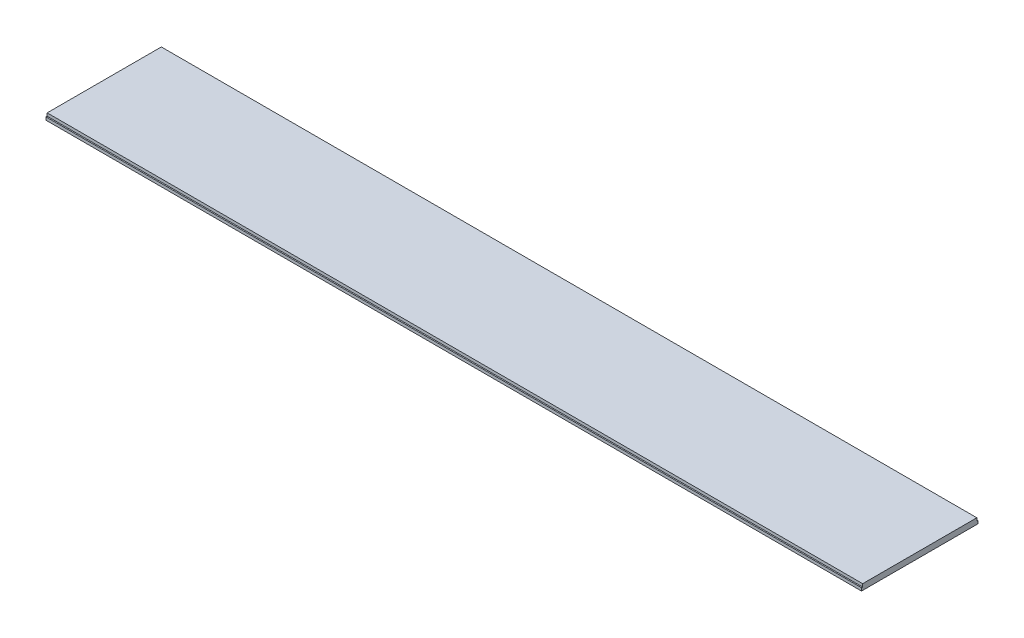
ISO-10303-21;
HEADER;
FILE_DESCRIPTION(('STEP AP214'),'2;1');
FILE_NAME('part.step','',(''),(''),'','','');
FILE_SCHEMA(('AUTOMOTIVE_DESIGN { 1 0 10303 214 1 1 1 1 }'));
ENDSEC;
DATA;
#1=APPLICATION_CONTEXT('core data for automotive mechanical design processes');
#2=APPLICATION_PROTOCOL_DEFINITION('international standard','automotive_design',2000,#1);
#3=PRODUCT_CONTEXT('',#1,'mechanical');
#4=PRODUCT('Part','Part','',(#3));
#5=PRODUCT_RELATED_PRODUCT_CATEGORY('part','',(#4));
#6=PRODUCT_DEFINITION_FORMATION('','',#4);
#7=PRODUCT_DEFINITION_CONTEXT('part definition',#1,'design');
#8=PRODUCT_DEFINITION('design','',#6,#7);
#9=PRODUCT_DEFINITION_SHAPE('','',#8);
#10=(LENGTH_UNIT() NAMED_UNIT(*) SI_UNIT(.MILLI.,.METRE.));
#11=(NAMED_UNIT(*) PLANE_ANGLE_UNIT() SI_UNIT($,.RADIAN.));
#12=(NAMED_UNIT(*) SI_UNIT($,.STERADIAN.) SOLID_ANGLE_UNIT());
#13=UNCERTAINTY_MEASURE_WITH_UNIT(LENGTH_MEASURE(1.E-05),#10,'distance_accuracy_value','');
#14=(GEOMETRIC_REPRESENTATION_CONTEXT(3) GLOBAL_UNCERTAINTY_ASSIGNED_CONTEXT((#13)) GLOBAL_UNIT_ASSIGNED_CONTEXT((#10,
#11,#12)) REPRESENTATION_CONTEXT('',''));
#15=CARTESIAN_POINT('',(0.,0.,0.));
#16=DIRECTION('',(0.,0.,1.));
#17=DIRECTION('',(1.,0.,0.));
#18=AXIS2_PLACEMENT_3D('',#15,#16,#17);
#19=CARTESIAN_POINT('',(-1400.,10.,200.));
#20=DIRECTION('',(1.,0.,0.));
#21=DIRECTION('',(0.,0.,-1.));
#22=AXIS2_PLACEMENT_3D('',#19,#20,#21);
#23=PLANE('',#22);
#24=DIRECTION('',(0.,0.,1.));
#25=VECTOR('',#24,1.);
#26=CARTESIAN_POINT('',(-1400.,10.,200.));
#27=LINE('',#26,#25);
#28=CARTESIAN_POINT('',(-1400.,10.,2.00000000000017));
#29=VERTEX_POINT('',#28);
#30=CARTESIAN_POINT('',(-1400.,10.,198.));
#31=VERTEX_POINT('',#30);
#32=EDGE_CURVE('E131',#29,#31,#27,.T.);
#33=ORIENTED_EDGE('',*,*,#32,.F.);
#34=DIRECTION('',(0.,1.,0.));
#35=VECTOR('',#34,1.);
#36=CARTESIAN_POINT('',(-1400.,5.,2.00000000000018));
#37=LINE('',#36,#35);
#38=CARTESIAN_POINT('',(-1400.,5.,2.00000000000018));
#39=VERTEX_POINT('',#38);
#40=EDGE_CURVE('E58',#39,#29,#37,.T.);
#41=ORIENTED_EDGE('',*,*,#40,.F.);
#42=DIRECTION('',(0.,0.,1.));
#43=VECTOR('',#42,1.);
#44=CARTESIAN_POINT('',(-1400.,5.,0.));
#45=LINE('',#44,#43);
#46=CARTESIAN_POINT('',(-1400.,5.,0.));
#47=VERTEX_POINT('',#46);
#48=EDGE_CURVE('E119',#47,#39,#45,.T.);
#49=ORIENTED_EDGE('',*,*,#48,.F.);
#50=DIRECTION('',(0.,-1.,0.));
#51=VECTOR('',#50,1.);
#52=CARTESIAN_POINT('',(-1400.,10.,0.));
#53=LINE('',#52,#51);
#54=CARTESIAN_POINT('',(-1400.,0.,0.));
#55=VERTEX_POINT('',#54);
#56=EDGE_CURVE('E118',#47,#55,#53,.T.);
#57=ORIENTED_EDGE('',*,*,#56,.T.);
#58=DIRECTION('',(0.,0.,1.));
#59=VECTOR('',#58,1.);
#60=CARTESIAN_POINT('',(-1400.,0.,200.));
#61=LINE('',#60,#59);
#62=CARTESIAN_POINT('',(-1400.,0.,200.));
#63=VERTEX_POINT('',#62);
#64=EDGE_CURVE('E136',#55,#63,#61,.T.);
#65=ORIENTED_EDGE('',*,*,#64,.T.);
#66=DIRECTION('',(0.,-1.,0.));
#67=VECTOR('',#66,1.);
#68=CARTESIAN_POINT('',(-1400.,10.,200.));
#69=LINE('',#68,#67);
#70=CARTESIAN_POINT('',(-1400.,5.,200.));
#71=VERTEX_POINT('',#70);
#72=EDGE_CURVE('E11',#71,#63,#69,.T.);
#73=ORIENTED_EDGE('',*,*,#72,.F.);
#74=DIRECTION('',(0.,0.,1.));
#75=VECTOR('',#74,1.);
#76=CARTESIAN_POINT('',(-1400.,5.,200.));
#77=LINE('',#76,#75);
#78=CARTESIAN_POINT('',(-1400.,5.,198.));
#79=VERTEX_POINT('',#78);
#80=EDGE_CURVE('E151',#79,#71,#77,.T.);
#81=ORIENTED_EDGE('',*,*,#80,.F.);
#82=DIRECTION('',(0.,1.,0.));
#83=VECTOR('',#82,1.);
#84=CARTESIAN_POINT('',(-1400.,5.,198.));
#85=LINE('',#84,#83);
#86=EDGE_CURVE('E145',#79,#31,#85,.T.);
#87=ORIENTED_EDGE('',*,*,#86,.T.);
#88=EDGE_LOOP('',(#33,#41,#49,#57,#65,#73,#81,#87));
#89=FACE_BOUND('',#88,.T.);
#90=ADVANCED_FACE('F36',(#89),#23,.F.);
#91=CARTESIAN_POINT('',(-1400.,10.,200.));
#92=DIRECTION('',(0.,0.,-1.));
#93=DIRECTION('',(-1.,0.,0.));
#94=AXIS2_PLACEMENT_3D('',#91,#92,#93);
#95=PLANE('',#94);
#96=DIRECTION('',(0.,-1.,0.));
#97=VECTOR('',#96,1.);
#98=CARTESIAN_POINT('',(0.,10.,200.));
#99=LINE('',#98,#97);
#100=CARTESIAN_POINT('',(0.,5.,200.));
#101=VERTEX_POINT('',#100);
#102=CARTESIAN_POINT('',(0.,0.,200.));
#103=VERTEX_POINT('',#102);
#104=EDGE_CURVE('E43',#101,#103,#99,.T.);
#105=ORIENTED_EDGE('',*,*,#104,.F.);
#106=DIRECTION('',(1.,0.,0.));
#107=VECTOR('',#106,1.);
#108=CARTESIAN_POINT('',(-1400.,5.,200.));
#109=LINE('',#108,#107);
#110=EDGE_CURVE('E156',#71,#101,#109,.T.);
#111=ORIENTED_EDGE('',*,*,#110,.F.);
#112=ORIENTED_EDGE('',*,*,#72,.T.);
#113=DIRECTION('',(1.,0.,0.));
#114=VECTOR('',#113,1.);
#115=CARTESIAN_POINT('',(-1400.,0.,200.));
#116=LINE('',#115,#114);
#117=EDGE_CURVE('E133',#63,#103,#116,.T.);
#118=ORIENTED_EDGE('',*,*,#117,.T.);
#119=EDGE_LOOP('',(#105,#111,#112,#118));
#120=FACE_BOUND('',#119,.T.);
#121=ADVANCED_FACE('F175',(#120),#95,.F.);
#122=CARTESIAN_POINT('',(0.,10.,200.));
#123=DIRECTION('',(-1.,0.,0.));
#124=DIRECTION('',(0.,0.,1.));
#125=AXIS2_PLACEMENT_3D('',#122,#123,#124);
#126=PLANE('',#125);
#127=DIRECTION('',(0.,0.,-1.));
#128=VECTOR('',#127,1.);
#129=CARTESIAN_POINT('',(0.,5.,0.));
#130=LINE('',#129,#128);
#131=CARTESIAN_POINT('',(0.,5.,2.));
#132=VERTEX_POINT('',#131);
#133=CARTESIAN_POINT('',(0.,5.,0.));
#134=VERTEX_POINT('',#133);
#135=EDGE_CURVE('E101',#132,#134,#130,.T.);
#136=ORIENTED_EDGE('',*,*,#135,.F.);
#137=DIRECTION('',(0.,1.,0.));
#138=VECTOR('',#137,1.);
#139=CARTESIAN_POINT('',(0.,5.,2.));
#140=LINE('',#139,#138);
#141=CARTESIAN_POINT('',(0.,10.,2.));
#142=VERTEX_POINT('',#141);
#143=EDGE_CURVE('E139',#132,#142,#140,.T.);
#144=ORIENTED_EDGE('',*,*,#143,.T.);
#145=DIRECTION('',(0.,0.,-1.));
#146=VECTOR('',#145,1.);
#147=CARTESIAN_POINT('',(0.,10.,200.));
#148=LINE('',#147,#146);
#149=CARTESIAN_POINT('',(0.,10.,198.));
#150=VERTEX_POINT('',#149);
#151=EDGE_CURVE('E126',#150,#142,#148,.T.);
#152=ORIENTED_EDGE('',*,*,#151,.F.);
#153=DIRECTION('',(0.,1.,0.));
#154=VECTOR('',#153,1.);
#155=CARTESIAN_POINT('',(0.,5.,198.));
#156=LINE('',#155,#154);
#157=CARTESIAN_POINT('',(0.,5.,198.));
#158=VERTEX_POINT('',#157);
#159=EDGE_CURVE('E50',#158,#150,#156,.T.);
#160=ORIENTED_EDGE('',*,*,#159,.F.);
#161=DIRECTION('',(0.,0.,-1.));
#162=VECTOR('',#161,1.);
#163=CARTESIAN_POINT('',(0.,5.,200.));
#164=LINE('',#163,#162);
#165=EDGE_CURVE('E154',#101,#158,#164,.T.);
#166=ORIENTED_EDGE('',*,*,#165,.F.);
#167=ORIENTED_EDGE('',*,*,#104,.T.);
#168=DIRECTION('',(0.,0.,-1.));
#169=VECTOR('',#168,1.);
#170=CARTESIAN_POINT('',(0.,0.,200.));
#171=LINE('',#170,#169);
#172=CARTESIAN_POINT('',(0.,0.,0.));
#173=VERTEX_POINT('',#172);
#174=EDGE_CURVE('E123',#103,#173,#171,.T.);
#175=ORIENTED_EDGE('',*,*,#174,.T.);
#176=DIRECTION('',(0.,-1.,0.));
#177=VECTOR('',#176,1.);
#178=CARTESIAN_POINT('',(0.,10.,0.));
#179=LINE('',#178,#177);
#180=EDGE_CURVE('E116',#134,#173,#179,.T.);
#181=ORIENTED_EDGE('',*,*,#180,.F.);
#182=EDGE_LOOP('',(#136,#144,#152,#160,#166,#167,#175,#181));
#183=FACE_BOUND('',#182,.T.);
#184=ADVANCED_FACE('F121',(#183),#126,.F.);
#185=CARTESIAN_POINT('',(-1400.,10.,0.));
#186=DIRECTION('',(0.,0.,1.));
#187=DIRECTION('',(1.,0.,0.));
#188=AXIS2_PLACEMENT_3D('',#185,#186,#187);
#189=PLANE('',#188);
#190=ORIENTED_EDGE('',*,*,#56,.F.);
#191=DIRECTION('',(-1.,0.,0.));
#192=VECTOR('',#191,1.);
#193=CARTESIAN_POINT('',(0.,5.,0.));
#194=LINE('',#193,#192);
#195=EDGE_CURVE('E104',#134,#47,#194,.T.);
#196=ORIENTED_EDGE('',*,*,#195,.F.);
#197=ORIENTED_EDGE('',*,*,#180,.T.);
#198=DIRECTION('',(-1.,0.,0.));
#199=VECTOR('',#198,1.);
#200=CARTESIAN_POINT('',(-1400.,0.,0.));
#201=LINE('',#200,#199);
#202=EDGE_CURVE('E129',#173,#55,#201,.T.);
#203=ORIENTED_EDGE('',*,*,#202,.T.);
#204=EDGE_LOOP('',(#190,#196,#197,#203));
#205=FACE_BOUND('',#204,.T.);
#206=ADVANCED_FACE('F114',(#205),#189,.F.);
#207=CARTESIAN_POINT('',(0.,10.,0.));
#208=DIRECTION('',(0.,-1.,0.));
#209=DIRECTION('',(0.,0.,-1.));
#210=AXIS2_PLACEMENT_3D('',#207,#208,#209);
#211=PLANE('',#210);
#212=ORIENTED_EDGE('',*,*,#151,.T.);
#213=DIRECTION('',(1.,0.,0.));
#214=VECTOR('',#213,1.);
#215=CARTESIAN_POINT('',(0.,10.,2.));
#216=LINE('',#215,#214);
#217=EDGE_CURVE('E110',#29,#142,#216,.T.);
#218=ORIENTED_EDGE('',*,*,#217,.F.);
#219=ORIENTED_EDGE('',*,*,#32,.T.);
#220=DIRECTION('',(-1.,0.,0.));
#221=VECTOR('',#220,1.);
#222=CARTESIAN_POINT('',(-1400.,10.,198.));
#223=LINE('',#222,#221);
#224=EDGE_CURVE('E149',#150,#31,#223,.T.);
#225=ORIENTED_EDGE('',*,*,#224,.F.);
#226=EDGE_LOOP('',(#212,#218,#219,#225));
#227=FACE_BOUND('',#226,.T.);
#228=ADVANCED_FACE('F168',(#227),#211,.F.);
#229=CARTESIAN_POINT('',(0.,0.,0.));
#230=DIRECTION('',(0.,-1.,0.));
#231=DIRECTION('',(0.,0.,-1.));
#232=AXIS2_PLACEMENT_3D('',#229,#230,#231);
#233=PLANE('',#232);
#234=ORIENTED_EDGE('',*,*,#64,.F.);
#235=ORIENTED_EDGE('',*,*,#202,.F.);
#236=ORIENTED_EDGE('',*,*,#174,.F.);
#237=ORIENTED_EDGE('',*,*,#117,.F.);
#238=EDGE_LOOP('',(#234,#235,#236,#237));
#239=FACE_BOUND('',#238,.T.);
#240=ADVANCED_FACE('F180',(#239),#233,.T.);
#241=CARTESIAN_POINT('',(-1400.,5.,198.));
#242=DIRECTION('',(0.,0.,-1.));
#243=DIRECTION('',(-1.,0.,0.));
#244=AXIS2_PLACEMENT_3D('',#241,#242,#243);
#245=PLANE('',#244);
#246=ORIENTED_EDGE('',*,*,#224,.T.);
#247=ORIENTED_EDGE('',*,*,#86,.F.);
#248=DIRECTION('',(-1.,0.,0.));
#249=VECTOR('',#248,1.);
#250=CARTESIAN_POINT('',(-1400.,5.,198.));
#251=LINE('',#250,#249);
#252=EDGE_CURVE('E146',#158,#79,#251,.T.);
#253=ORIENTED_EDGE('',*,*,#252,.F.);
#254=ORIENTED_EDGE('',*,*,#159,.T.);
#255=EDGE_LOOP('',(#246,#247,#253,#254));
#256=FACE_BOUND('',#255,.T.);
#257=ADVANCED_FACE('F182',(#256),#245,.F.);
#258=CARTESIAN_POINT('',(0.,5.,0.));
#259=DIRECTION('',(0.,-1.,0.));
#260=DIRECTION('',(0.,0.,-1.));
#261=AXIS2_PLACEMENT_3D('',#258,#259,#260);
#262=PLANE('',#261);
#263=ORIENTED_EDGE('',*,*,#80,.T.);
#264=ORIENTED_EDGE('',*,*,#110,.T.);
#265=ORIENTED_EDGE('',*,*,#165,.T.);
#266=ORIENTED_EDGE('',*,*,#252,.T.);
#267=EDGE_LOOP('',(#263,#264,#265,#266));
#268=FACE_BOUND('',#267,.T.);
#269=ADVANCED_FACE('F181',(#268),#262,.F.);
#270=CARTESIAN_POINT('',(0.,5.,2.));
#271=DIRECTION('',(0.,0.,1.));
#272=DIRECTION('',(1.,0.,0.));
#273=AXIS2_PLACEMENT_3D('',#270,#271,#272);
#274=PLANE('',#273);
#275=ORIENTED_EDGE('',*,*,#217,.T.);
#276=ORIENTED_EDGE('',*,*,#143,.F.);
#277=DIRECTION('',(1.,0.,0.));
#278=VECTOR('',#277,1.);
#279=CARTESIAN_POINT('',(0.,5.,2.));
#280=LINE('',#279,#278);
#281=EDGE_CURVE('E106',#39,#132,#280,.T.);
#282=ORIENTED_EDGE('',*,*,#281,.F.);
#283=ORIENTED_EDGE('',*,*,#40,.T.);
#284=EDGE_LOOP('',(#275,#276,#282,#283));
#285=FACE_BOUND('',#284,.T.);
#286=ADVANCED_FACE('F164',(#285),#274,.F.);
#287=CARTESIAN_POINT('',(0.,5.,0.));
#288=DIRECTION('',(0.,-1.,0.));
#289=DIRECTION('',(0.,0.,-1.));
#290=AXIS2_PLACEMENT_3D('',#287,#288,#289);
#291=PLANE('',#290);
#292=ORIENTED_EDGE('',*,*,#135,.T.);
#293=ORIENTED_EDGE('',*,*,#195,.T.);
#294=ORIENTED_EDGE('',*,*,#48,.T.);
#295=ORIENTED_EDGE('',*,*,#281,.T.);
#296=EDGE_LOOP('',(#292,#293,#294,#295));
#297=FACE_BOUND('',#296,.T.);
#298=ADVANCED_FACE('F103',(#297),#291,.F.);
#299=CLOSED_SHELL('',(#90,#121,#184,#206,#228,#240,#257,#269,#286,#298));
#300=MANIFOLD_SOLID_BREP('B2',#299);
#301=ADVANCED_BREP_SHAPE_REPRESENTATION('',(#18,#300),#14);
#302=SHAPE_DEFINITION_REPRESENTATION(#9,#301);
ENDSEC;
END-ISO-10303-21;
